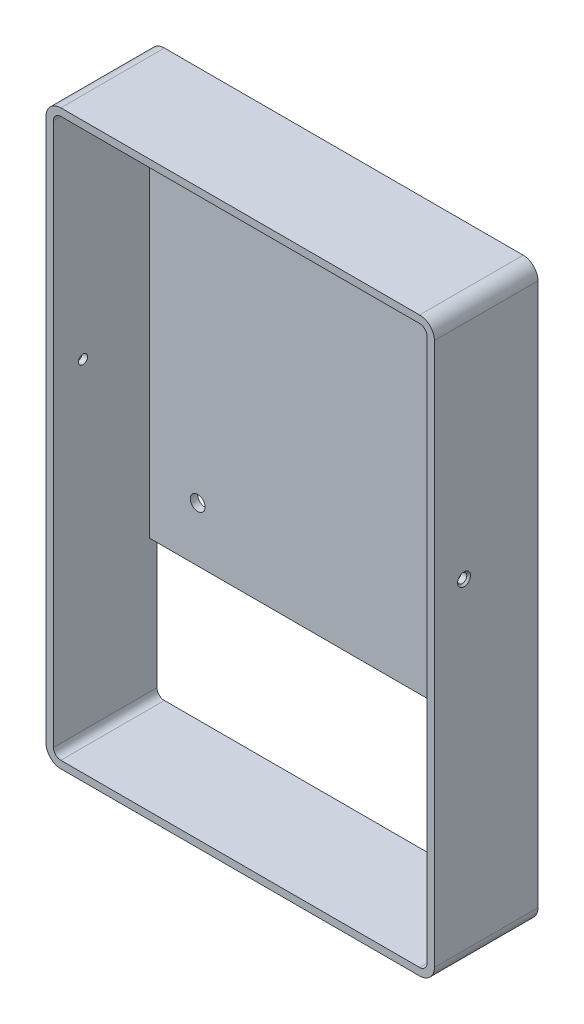
ISO-10303-21;
HEADER;
FILE_DESCRIPTION(('STEP AP214'),'2;1');
FILE_NAME('part.step','',(''),(''),'','','');
FILE_SCHEMA(('AUTOMOTIVE_DESIGN { 1 0 10303 214 1 1 1 1 }'));
ENDSEC;
DATA;
#1=APPLICATION_CONTEXT('core data for automotive mechanical design processes');
#2=APPLICATION_PROTOCOL_DEFINITION('international standard','automotive_design',2000,#1);
#3=PRODUCT_CONTEXT('',#1,'mechanical');
#4=PRODUCT('Part','Part','',(#3));
#5=PRODUCT_RELATED_PRODUCT_CATEGORY('part','',(#4));
#6=PRODUCT_DEFINITION_FORMATION('','',#4);
#7=PRODUCT_DEFINITION_CONTEXT('part definition',#1,'design');
#8=PRODUCT_DEFINITION('design','',#6,#7);
#9=PRODUCT_DEFINITION_SHAPE('','',#8);
#10=(LENGTH_UNIT() NAMED_UNIT(*) SI_UNIT(.MILLI.,.METRE.));
#11=(NAMED_UNIT(*) PLANE_ANGLE_UNIT() SI_UNIT($,.RADIAN.));
#12=(NAMED_UNIT(*) SI_UNIT($,.STERADIAN.) SOLID_ANGLE_UNIT());
#13=UNCERTAINTY_MEASURE_WITH_UNIT(LENGTH_MEASURE(1.E-05),#10,'distance_accuracy_value','');
#14=(GEOMETRIC_REPRESENTATION_CONTEXT(3) GLOBAL_UNCERTAINTY_ASSIGNED_CONTEXT((#13)) GLOBAL_UNIT_ASSIGNED_CONTEXT((#10,
#11,#12)) REPRESENTATION_CONTEXT('',''));
#15=CARTESIAN_POINT('',(0.,0.,0.));
#16=DIRECTION('',(0.,0.,1.));
#17=DIRECTION('',(1.,0.,0.));
#18=AXIS2_PLACEMENT_3D('',#15,#16,#17);
#19=CARTESIAN_POINT('',(48.5,59.875,-28.));
#20=DIRECTION('',(0.,0.,1.));
#21=DIRECTION('',(1.,0.,0.));
#22=AXIS2_PLACEMENT_3D('',#19,#20,#21);
#23=CYLINDRICAL_SURFACE('',#22,4.);
#24=CARTESIAN_POINT('',(48.5,59.875,0.));
#25=DIRECTION('',(0.,0.,1.));
#26=DIRECTION('',(1.,0.,0.));
#27=AXIS2_PLACEMENT_3D('',#24,#25,#26);
#28=CIRCLE('',#27,4.);
#29=CARTESIAN_POINT('',(52.5,59.875,0.));
#30=VERTEX_POINT('',#29);
#31=CARTESIAN_POINT('',(48.5,63.875,0.));
#32=VERTEX_POINT('',#31);
#33=EDGE_CURVE('E211',#30,#32,#28,.T.);
#34=ORIENTED_EDGE('',*,*,#33,.F.);
#35=DIRECTION('',(0.,0.,1.));
#36=VECTOR('',#35,1.);
#37=CARTESIAN_POINT('',(52.5,59.875,-28.));
#38=LINE('',#37,#36);
#39=CARTESIAN_POINT('',(52.5,59.875,-28.));
#40=VERTEX_POINT('',#39);
#41=EDGE_CURVE('E45',#40,#30,#38,.T.);
#42=ORIENTED_EDGE('',*,*,#41,.F.);
#43=CARTESIAN_POINT('',(48.5,59.875,-28.));
#44=DIRECTION('',(0.,0.,1.));
#45=DIRECTION('',(1.,0.,0.));
#46=AXIS2_PLACEMENT_3D('',#43,#44,#45);
#47=CIRCLE('',#46,4.);
#48=CARTESIAN_POINT('',(48.5,63.875,-28.));
#49=VERTEX_POINT('',#48);
#50=EDGE_CURVE('E259',#40,#49,#47,.T.);
#51=ORIENTED_EDGE('',*,*,#50,.T.);
#52=DIRECTION('',(0.,0.,1.));
#53=VECTOR('',#52,1.);
#54=CARTESIAN_POINT('',(48.5,63.875,-28.));
#55=LINE('',#54,#53);
#56=EDGE_CURVE('E285',#49,#32,#55,.T.);
#57=ORIENTED_EDGE('',*,*,#56,.T.);
#58=EDGE_LOOP('',(#34,#42,#51,#57));
#59=FACE_BOUND('',#58,.T.);
#60=ADVANCED_FACE('F38',(#59),#23,.T.);
#61=CARTESIAN_POINT('',(52.5,59.875,-28.));
#62=DIRECTION('',(1.,0.,0.));
#63=DIRECTION('',(0.,1.,0.));
#64=AXIS2_PLACEMENT_3D('',#61,#62,#63);
#65=PLANE('',#64);
#66=CARTESIAN_POINT('',(52.5,0.,-8.));
#67=DIRECTION('',(1.,0.,0.));
#68=DIRECTION('',(0.,0.,-1.));
#69=AXIS2_PLACEMENT_3D('',#66,#67,#68);
#70=CIRCLE('',#69,1.75);
#71=CARTESIAN_POINT('',(52.5,0.,-9.75));
#72=VERTEX_POINT('',#71);
#73=EDGE_CURVE('E648',#72,#72,#70,.T.);
#74=ORIENTED_EDGE('',*,*,#73,.F.);
#75=EDGE_LOOP('',(#74));
#76=FACE_BOUND('',#75,.T.);
#77=DIRECTION('',(0.,1.,0.));
#78=VECTOR('',#77,1.);
#79=CARTESIAN_POINT('',(52.5,59.875,0.));
#80=LINE('',#79,#78);
#81=CARTESIAN_POINT('',(52.5,-86.875,0.));
#82=VERTEX_POINT('',#81);
#83=EDGE_CURVE('E263',#82,#30,#80,.T.);
#84=ORIENTED_EDGE('',*,*,#83,.F.);
#85=DIRECTION('',(0.,0.,1.));
#86=VECTOR('',#85,1.);
#87=CARTESIAN_POINT('',(52.5,-86.875,-28.));
#88=LINE('',#87,#86);
#89=CARTESIAN_POINT('',(52.5,-86.875,-28.));
#90=VERTEX_POINT('',#89);
#91=EDGE_CURVE('E310',#90,#82,#88,.T.);
#92=ORIENTED_EDGE('',*,*,#91,.F.);
#93=DIRECTION('',(0.,1.,0.));
#94=VECTOR('',#93,1.);
#95=CARTESIAN_POINT('',(52.5,59.875,-28.));
#96=LINE('',#95,#94);
#97=EDGE_CURVE('E282',#90,#40,#96,.T.);
#98=ORIENTED_EDGE('',*,*,#97,.T.);
#99=ORIENTED_EDGE('',*,*,#41,.T.);
#100=EDGE_LOOP('',(#84,#92,#98,#99));
#101=FACE_BOUND('',#100,.T.);
#102=ADVANCED_FACE('F367',(#76,#101),#65,.T.);
#103=CARTESIAN_POINT('',(48.5,-86.875,-28.));
#104=DIRECTION('',(0.,0.,1.));
#105=DIRECTION('',(1.,0.,0.));
#106=AXIS2_PLACEMENT_3D('',#103,#104,#105);
#107=CYLINDRICAL_SURFACE('',#106,4.);
#108=CARTESIAN_POINT('',(48.5,-86.875,0.));
#109=DIRECTION('',(0.,0.,1.));
#110=DIRECTION('',(1.,0.,0.));
#111=AXIS2_PLACEMENT_3D('',#108,#109,#110);
#112=CIRCLE('',#111,4.);
#113=CARTESIAN_POINT('',(48.5,-90.875,0.));
#114=VERTEX_POINT('',#113);
#115=EDGE_CURVE('E304',#114,#82,#112,.T.);
#116=ORIENTED_EDGE('',*,*,#115,.F.);
#117=DIRECTION('',(0.,0.,1.));
#118=VECTOR('',#117,1.);
#119=CARTESIAN_POINT('',(48.5,-90.875,-28.));
#120=LINE('',#119,#118);
#121=CARTESIAN_POINT('',(48.5,-90.875,-28.));
#122=VERTEX_POINT('',#121);
#123=EDGE_CURVE('E312',#122,#114,#120,.T.);
#124=ORIENTED_EDGE('',*,*,#123,.F.);
#125=CARTESIAN_POINT('',(48.5,-86.875,-28.));
#126=DIRECTION('',(0.,0.,1.));
#127=DIRECTION('',(1.,0.,0.));
#128=AXIS2_PLACEMENT_3D('',#125,#126,#127);
#129=CIRCLE('',#128,4.);
#130=EDGE_CURVE('E279',#122,#90,#129,.T.);
#131=ORIENTED_EDGE('',*,*,#130,.T.);
#132=ORIENTED_EDGE('',*,*,#91,.T.);
#133=EDGE_LOOP('',(#116,#124,#131,#132));
#134=FACE_BOUND('',#133,.T.);
#135=ADVANCED_FACE('F371',(#134),#107,.T.);
#136=CARTESIAN_POINT('',(-48.5,-90.875,-28.));
#137=DIRECTION('',(0.,-1.,0.));
#138=DIRECTION('',(1.,0.,0.));
#139=AXIS2_PLACEMENT_3D('',#136,#137,#138);
#140=PLANE('',#139);
#141=DIRECTION('',(1.,0.,0.));
#142=VECTOR('',#141,1.);
#143=CARTESIAN_POINT('',(-48.5,-90.875,0.));
#144=LINE('',#143,#142);
#145=CARTESIAN_POINT('',(-48.5,-90.875,0.));
#146=VERTEX_POINT('',#145);
#147=EDGE_CURVE('E301',#146,#114,#144,.T.);
#148=ORIENTED_EDGE('',*,*,#147,.F.);
#149=DIRECTION('',(0.,0.,1.));
#150=VECTOR('',#149,1.);
#151=CARTESIAN_POINT('',(-48.5,-90.875,-28.));
#152=LINE('',#151,#150);
#153=CARTESIAN_POINT('',(-48.5,-90.875,-28.));
#154=VERTEX_POINT('',#153);
#155=EDGE_CURVE('E314',#154,#146,#152,.T.);
#156=ORIENTED_EDGE('',*,*,#155,.F.);
#157=DIRECTION('',(1.,0.,0.));
#158=VECTOR('',#157,1.);
#159=CARTESIAN_POINT('',(-48.5,-90.875,-28.));
#160=LINE('',#159,#158);
#161=EDGE_CURVE('E276',#154,#122,#160,.T.);
#162=ORIENTED_EDGE('',*,*,#161,.T.);
#163=ORIENTED_EDGE('',*,*,#123,.T.);
#164=EDGE_LOOP('',(#148,#156,#162,#163));
#165=FACE_BOUND('',#164,.T.);
#166=ADVANCED_FACE('F376',(#165),#140,.T.);
#167=CARTESIAN_POINT('',(-48.5,-86.875,-28.));
#168=DIRECTION('',(0.,0.,1.));
#169=DIRECTION('',(1.,0.,0.));
#170=AXIS2_PLACEMENT_3D('',#167,#168,#169);
#171=CYLINDRICAL_SURFACE('',#170,4.);
#172=CARTESIAN_POINT('',(-48.5,-86.875,0.));
#173=DIRECTION('',(0.,0.,1.));
#174=DIRECTION('',(-1.,0.,0.));
#175=AXIS2_PLACEMENT_3D('',#172,#173,#174);
#176=CIRCLE('',#175,4.);
#177=CARTESIAN_POINT('',(-52.5,-86.875,0.));
#178=VERTEX_POINT('',#177);
#179=EDGE_CURVE('E298',#178,#146,#176,.T.);
#180=ORIENTED_EDGE('',*,*,#179,.F.);
#181=DIRECTION('',(0.,0.,1.));
#182=VECTOR('',#181,1.);
#183=CARTESIAN_POINT('',(-52.5,-86.875,-28.));
#184=LINE('',#183,#182);
#185=CARTESIAN_POINT('',(-52.5,-86.875,-28.));
#186=VERTEX_POINT('',#185);
#187=EDGE_CURVE('E316',#186,#178,#184,.T.);
#188=ORIENTED_EDGE('',*,*,#187,.F.);
#189=CARTESIAN_POINT('',(-48.5,-86.875,-28.));
#190=DIRECTION('',(0.,0.,1.));
#191=DIRECTION('',(-1.,0.,0.));
#192=AXIS2_PLACEMENT_3D('',#189,#190,#191);
#193=CIRCLE('',#192,4.);
#194=EDGE_CURVE('E273',#186,#154,#193,.T.);
#195=ORIENTED_EDGE('',*,*,#194,.T.);
#196=ORIENTED_EDGE('',*,*,#155,.T.);
#197=EDGE_LOOP('',(#180,#188,#195,#196));
#198=FACE_BOUND('',#197,.T.);
#199=ADVANCED_FACE('F379',(#198),#171,.T.);
#200=CARTESIAN_POINT('',(-52.5,59.875,-28.));
#201=DIRECTION('',(-1.,0.,0.));
#202=DIRECTION('',(0.,-1.,0.));
#203=AXIS2_PLACEMENT_3D('',#200,#201,#202);
#204=PLANE('',#203);
#205=CARTESIAN_POINT('',(-52.5,0.,-8.));
#206=DIRECTION('',(-1.,0.,0.));
#207=DIRECTION('',(0.,0.,1.));
#208=AXIS2_PLACEMENT_3D('',#205,#206,#207);
#209=CIRCLE('',#208,1.75);
#210=CARTESIAN_POINT('',(-52.5,0.,-6.25));
#211=VERTEX_POINT('',#210);
#212=EDGE_CURVE('E641',#211,#211,#209,.T.);
#213=ORIENTED_EDGE('',*,*,#212,.F.);
#214=EDGE_LOOP('',(#213));
#215=FACE_BOUND('',#214,.T.);
#216=DIRECTION('',(0.,-1.,0.));
#217=VECTOR('',#216,1.);
#218=CARTESIAN_POINT('',(-52.5,59.875,0.));
#219=LINE('',#218,#217);
#220=CARTESIAN_POINT('',(-52.5,59.875,0.));
#221=VERTEX_POINT('',#220);
#222=EDGE_CURVE('E294',#221,#178,#219,.T.);
#223=ORIENTED_EDGE('',*,*,#222,.F.);
#224=DIRECTION('',(0.,0.,1.));
#225=VECTOR('',#224,1.);
#226=CARTESIAN_POINT('',(-52.5,59.875,-28.));
#227=LINE('',#226,#225);
#228=CARTESIAN_POINT('',(-52.5,59.875,-28.));
#229=VERTEX_POINT('',#228);
#230=EDGE_CURVE('E318',#229,#221,#227,.T.);
#231=ORIENTED_EDGE('',*,*,#230,.F.);
#232=DIRECTION('',(0.,-1.,0.));
#233=VECTOR('',#232,1.);
#234=CARTESIAN_POINT('',(-52.5,59.875,-28.));
#235=LINE('',#234,#233);
#236=EDGE_CURVE('E269',#229,#186,#235,.T.);
#237=ORIENTED_EDGE('',*,*,#236,.T.);
#238=ORIENTED_EDGE('',*,*,#187,.T.);
#239=EDGE_LOOP('',(#223,#231,#237,#238));
#240=FACE_BOUND('',#239,.T.);
#241=ADVANCED_FACE('F383',(#215,#240),#204,.T.);
#242=CARTESIAN_POINT('',(-48.5,59.875,-28.));
#243=DIRECTION('',(0.,0.,1.));
#244=DIRECTION('',(1.,0.,0.));
#245=AXIS2_PLACEMENT_3D('',#242,#243,#244);
#246=CYLINDRICAL_SURFACE('',#245,4.00000000000001);
#247=CARTESIAN_POINT('',(-48.5,59.875,0.));
#248=DIRECTION('',(0.,0.,1.));
#249=DIRECTION('',(-1.,0.,0.));
#250=AXIS2_PLACEMENT_3D('',#247,#248,#249);
#251=CIRCLE('',#250,4.00000000000001);
#252=CARTESIAN_POINT('',(-48.5,63.875,0.));
#253=VERTEX_POINT('',#252);
#254=EDGE_CURVE('E291',#253,#221,#251,.T.);
#255=ORIENTED_EDGE('',*,*,#254,.F.);
#256=DIRECTION('',(0.,0.,1.));
#257=VECTOR('',#256,1.);
#258=CARTESIAN_POINT('',(-48.5,63.875,-28.));
#259=LINE('',#258,#257);
#260=CARTESIAN_POINT('',(-48.5,63.875,-28.));
#261=VERTEX_POINT('',#260);
#262=EDGE_CURVE('E320',#261,#253,#259,.T.);
#263=ORIENTED_EDGE('',*,*,#262,.F.);
#264=CARTESIAN_POINT('',(-48.5,59.875,-28.));
#265=DIRECTION('',(0.,0.,1.));
#266=DIRECTION('',(-1.,0.,0.));
#267=AXIS2_PLACEMENT_3D('',#264,#265,#266);
#268=CIRCLE('',#267,4.00000000000001);
#269=EDGE_CURVE('E266',#261,#229,#268,.T.);
#270=ORIENTED_EDGE('',*,*,#269,.T.);
#271=ORIENTED_EDGE('',*,*,#230,.T.);
#272=EDGE_LOOP('',(#255,#263,#270,#271));
#273=FACE_BOUND('',#272,.T.);
#274=ADVANCED_FACE('F386',(#273),#246,.T.);
#275=CARTESIAN_POINT('',(-48.5,63.875,-28.));
#276=DIRECTION('',(0.,1.,0.));
#277=DIRECTION('',(-1.,0.,0.));
#278=AXIS2_PLACEMENT_3D('',#275,#276,#277);
#279=PLANE('',#278);
#280=DIRECTION('',(-1.,0.,0.));
#281=VECTOR('',#280,1.);
#282=CARTESIAN_POINT('',(-48.5,63.875,0.));
#283=LINE('',#282,#281);
#284=EDGE_CURVE('E288',#32,#253,#283,.T.);
#285=ORIENTED_EDGE('',*,*,#284,.F.);
#286=ORIENTED_EDGE('',*,*,#56,.F.);
#287=DIRECTION('',(-1.,0.,0.));
#288=VECTOR('',#287,1.);
#289=CARTESIAN_POINT('',(-48.5,63.875,-28.));
#290=LINE('',#289,#288);
#291=EDGE_CURVE('E262',#49,#261,#290,.T.);
#292=ORIENTED_EDGE('',*,*,#291,.T.);
#293=ORIENTED_EDGE('',*,*,#262,.T.);
#294=EDGE_LOOP('',(#285,#286,#292,#293));
#295=FACE_BOUND('',#294,.T.);
#296=ADVANCED_FACE('F357',(#295),#279,.T.);
#297=CARTESIAN_POINT('',(48.5,59.875,-28.));
#298=DIRECTION('',(0.,0.,1.));
#299=DIRECTION('',(1.,0.,0.));
#300=AXIS2_PLACEMENT_3D('',#297,#298,#299);
#301=PLANE('',#300);
#302=CARTESIAN_POINT('',(48.5,-86.875,-28.));
#303=DIRECTION('',(0.,0.,-1.));
#304=DIRECTION('',(-1.,0.,0.));
#305=AXIS2_PLACEMENT_3D('',#302,#303,#304);
#306=CIRCLE('',#305,2.00000000000001);
#307=CARTESIAN_POINT('',(50.5,-86.875,-28.));
#308=VERTEX_POINT('',#307);
#309=CARTESIAN_POINT('',(48.5,-88.875,-28.));
#310=VERTEX_POINT('',#309);
#311=EDGE_CURVE('E171',#308,#310,#306,.T.);
#312=ORIENTED_EDGE('',*,*,#311,.F.);
#313=DIRECTION('',(0.,-1.,0.));
#314=VECTOR('',#313,1.);
#315=CARTESIAN_POINT('',(50.5,-50.875,-28.));
#316=LINE('',#315,#314);
#317=CARTESIAN_POINT('',(50.5,-50.875,-28.));
#318=VERTEX_POINT('',#317);
#319=EDGE_CURVE('E175',#318,#308,#316,.T.);
#320=ORIENTED_EDGE('',*,*,#319,.F.);
#321=DIRECTION('',(1.,0.,0.));
#322=VECTOR('',#321,1.);
#323=CARTESIAN_POINT('',(50.5,-50.875,-28.));
#324=LINE('',#323,#322);
#325=CARTESIAN_POINT('',(-50.5,-50.875,-28.));
#326=VERTEX_POINT('',#325);
#327=EDGE_CURVE('E189',#326,#318,#324,.T.);
#328=ORIENTED_EDGE('',*,*,#327,.F.);
#329=DIRECTION('',(0.,1.,0.));
#330=VECTOR('',#329,1.);
#331=CARTESIAN_POINT('',(-50.5,-50.875,-28.));
#332=LINE('',#331,#330);
#333=CARTESIAN_POINT('',(-50.5,-86.875,-28.));
#334=VERTEX_POINT('',#333);
#335=EDGE_CURVE('E183',#334,#326,#332,.T.);
#336=ORIENTED_EDGE('',*,*,#335,.F.);
#337=CARTESIAN_POINT('',(-48.5,-86.875,-28.));
#338=DIRECTION('',(0.,0.,-1.));
#339=DIRECTION('',(-1.,0.,0.));
#340=AXIS2_PLACEMENT_3D('',#337,#338,#339);
#341=CIRCLE('',#340,2.);
#342=CARTESIAN_POINT('',(-48.5,-88.875,-28.));
#343=VERTEX_POINT('',#342);
#344=EDGE_CURVE('E181',#343,#334,#341,.T.);
#345=ORIENTED_EDGE('',*,*,#344,.F.);
#346=DIRECTION('',(-1.,0.,0.));
#347=VECTOR('',#346,1.);
#348=CARTESIAN_POINT('',(-48.5,-88.875,-28.));
#349=LINE('',#348,#347);
#350=EDGE_CURVE('E163',#310,#343,#349,.T.);
#351=ORIENTED_EDGE('',*,*,#350,.F.);
#352=EDGE_LOOP('',(#312,#320,#328,#336,#345,#351));
#353=FACE_BOUND('',#352,.T.);
#354=CARTESIAN_POINT('',(37.5,-36.125,-28.));
#355=DIRECTION('',(0.,0.,-1.));
#356=DIRECTION('',(-1.,0.,0.));
#357=AXIS2_PLACEMENT_3D('',#354,#355,#356);
#358=CIRCLE('',#357,2.);
#359=CARTESIAN_POINT('',(35.5,-36.125,-28.));
#360=VERTEX_POINT('',#359);
#361=EDGE_CURVE('E195',#360,#360,#358,.T.);
#362=ORIENTED_EDGE('',*,*,#361,.F.);
#363=EDGE_LOOP('',(#362));
#364=FACE_BOUND('',#363,.T.);
#365=CARTESIAN_POINT('',(-37.5,-36.125,-28.));
#366=DIRECTION('',(0.,0.,-1.));
#367=DIRECTION('',(-1.,0.,0.));
#368=AXIS2_PLACEMENT_3D('',#365,#366,#367);
#369=CIRCLE('',#368,2.);
#370=CARTESIAN_POINT('',(-39.5,-36.125,-28.));
#371=VERTEX_POINT('',#370);
#372=EDGE_CURVE('E201',#371,#371,#369,.T.);
#373=ORIENTED_EDGE('',*,*,#372,.F.);
#374=EDGE_LOOP('',(#373));
#375=FACE_BOUND('',#374,.T.);
#376=CARTESIAN_POINT('',(-37.5,48.875,-28.));
#377=DIRECTION('',(0.,0.,-1.));
#378=DIRECTION('',(-1.,0.,0.));
#379=AXIS2_PLACEMENT_3D('',#376,#377,#378);
#380=CIRCLE('',#379,2.);
#381=CARTESIAN_POINT('',(-39.5,48.875,-28.));
#382=VERTEX_POINT('',#381);
#383=EDGE_CURVE('E197',#382,#382,#380,.T.);
#384=ORIENTED_EDGE('',*,*,#383,.F.);
#385=EDGE_LOOP('',(#384));
#386=FACE_BOUND('',#385,.T.);
#387=CARTESIAN_POINT('',(37.5,48.875,-28.));
#388=DIRECTION('',(0.,0.,-1.));
#389=DIRECTION('',(-1.,0.,0.));
#390=AXIS2_PLACEMENT_3D('',#387,#388,#389);
#391=CIRCLE('',#390,2.);
#392=CARTESIAN_POINT('',(35.5,48.875,-28.));
#393=VERTEX_POINT('',#392);
#394=EDGE_CURVE('E204',#393,#393,#391,.T.);
#395=ORIENTED_EDGE('',*,*,#394,.F.);
#396=EDGE_LOOP('',(#395));
#397=FACE_BOUND('',#396,.T.);
#398=ORIENTED_EDGE('',*,*,#50,.F.);
#399=ORIENTED_EDGE('',*,*,#97,.F.);
#400=ORIENTED_EDGE('',*,*,#130,.F.);
#401=ORIENTED_EDGE('',*,*,#161,.F.);
#402=ORIENTED_EDGE('',*,*,#194,.F.);
#403=ORIENTED_EDGE('',*,*,#236,.F.);
#404=ORIENTED_EDGE('',*,*,#269,.F.);
#405=ORIENTED_EDGE('',*,*,#291,.F.);
#406=EDGE_LOOP('',(#398,#399,#400,#401,#402,#403,#404,#405));
#407=FACE_BOUND('',#406,.T.);
#408=ADVANCED_FACE('F177',(#353,#364,#375,#386,#397,#407),#301,.F.);
#409=CARTESIAN_POINT('',(48.5,59.875,0.));
#410=DIRECTION('',(0.,0.,1.));
#411=DIRECTION('',(1.,0.,0.));
#412=AXIS2_PLACEMENT_3D('',#409,#410,#411);
#413=PLANE('',#412);
#414=CARTESIAN_POINT('',(48.5,59.875,0.));
#415=DIRECTION('',(0.,0.,1.));
#416=DIRECTION('',(1.,0.,0.));
#417=AXIS2_PLACEMENT_3D('',#414,#415,#416);
#418=CIRCLE('',#417,2.);
#419=CARTESIAN_POINT('',(50.5,59.875,0.));
#420=VERTEX_POINT('',#419);
#421=CARTESIAN_POINT('',(48.5,61.875,0.));
#422=VERTEX_POINT('',#421);
#423=EDGE_CURVE('E238',#420,#422,#418,.T.);
#424=ORIENTED_EDGE('',*,*,#423,.F.);
#425=DIRECTION('',(0.,1.,0.));
#426=VECTOR('',#425,1.);
#427=CARTESIAN_POINT('',(50.5,59.875,0.));
#428=LINE('',#427,#426);
#429=CARTESIAN_POINT('',(50.5,-86.875,0.));
#430=VERTEX_POINT('',#429);
#431=EDGE_CURVE('E216',#430,#420,#428,.T.);
#432=ORIENTED_EDGE('',*,*,#431,.F.);
#433=CARTESIAN_POINT('',(48.5,-86.875,0.));
#434=DIRECTION('',(0.,0.,1.));
#435=DIRECTION('',(1.,0.,0.));
#436=AXIS2_PLACEMENT_3D('',#433,#434,#435);
#437=CIRCLE('',#436,2.);
#438=CARTESIAN_POINT('',(48.5,-88.875,0.));
#439=VERTEX_POINT('',#438);
#440=EDGE_CURVE('E255',#439,#430,#437,.T.);
#441=ORIENTED_EDGE('',*,*,#440,.F.);
#442=DIRECTION('',(1.,0.,0.));
#443=VECTOR('',#442,1.);
#444=CARTESIAN_POINT('',(48.5,-88.875,0.));
#445=LINE('',#444,#443);
#446=CARTESIAN_POINT('',(-48.5,-88.875,0.));
#447=VERTEX_POINT('',#446);
#448=EDGE_CURVE('E166',#447,#439,#445,.T.);
#449=ORIENTED_EDGE('',*,*,#448,.F.);
#450=CARTESIAN_POINT('',(-48.5,-86.875,0.));
#451=DIRECTION('',(0.,0.,1.));
#452=DIRECTION('',(1.,0.,0.));
#453=AXIS2_PLACEMENT_3D('',#450,#451,#452);
#454=CIRCLE('',#453,2.);
#455=CARTESIAN_POINT('',(-50.5,-86.875,0.));
#456=VERTEX_POINT('',#455);
#457=EDGE_CURVE('E251',#456,#447,#454,.T.);
#458=ORIENTED_EDGE('',*,*,#457,.F.);
#459=DIRECTION('',(0.,-1.,0.));
#460=VECTOR('',#459,1.);
#461=CARTESIAN_POINT('',(-50.5,59.875,0.));
#462=LINE('',#461,#460);
#463=CARTESIAN_POINT('',(-50.5,59.875,0.));
#464=VERTEX_POINT('',#463);
#465=EDGE_CURVE('E247',#464,#456,#462,.T.);
#466=ORIENTED_EDGE('',*,*,#465,.F.);
#467=CARTESIAN_POINT('',(-48.5,59.875,0.));
#468=DIRECTION('',(0.,0.,1.));
#469=DIRECTION('',(1.,0.,0.));
#470=AXIS2_PLACEMENT_3D('',#467,#468,#469);
#471=CIRCLE('',#470,2.00000000000001);
#472=CARTESIAN_POINT('',(-48.5,61.875,0.));
#473=VERTEX_POINT('',#472);
#474=EDGE_CURVE('E244',#473,#464,#471,.T.);
#475=ORIENTED_EDGE('',*,*,#474,.F.);
#476=DIRECTION('',(-1.,0.,0.));
#477=VECTOR('',#476,1.);
#478=CARTESIAN_POINT('',(48.5,61.875,0.));
#479=LINE('',#478,#477);
#480=EDGE_CURVE('E241',#422,#473,#479,.T.);
#481=ORIENTED_EDGE('',*,*,#480,.F.);
#482=EDGE_LOOP('',(#424,#432,#441,#449,#458,#466,#475,#481));
#483=FACE_BOUND('',#482,.T.);
#484=ORIENTED_EDGE('',*,*,#33,.T.);
#485=ORIENTED_EDGE('',*,*,#284,.T.);
#486=ORIENTED_EDGE('',*,*,#254,.T.);
#487=ORIENTED_EDGE('',*,*,#222,.T.);
#488=ORIENTED_EDGE('',*,*,#179,.T.);
#489=ORIENTED_EDGE('',*,*,#147,.T.);
#490=ORIENTED_EDGE('',*,*,#115,.T.);
#491=ORIENTED_EDGE('',*,*,#83,.T.);
#492=EDGE_LOOP('',(#484,#485,#486,#487,#488,#489,#490,#491));
#493=FACE_BOUND('',#492,.T.);
#494=ADVANCED_FACE('F356',(#483,#493),#413,.T.);
#495=CARTESIAN_POINT('',(48.5,59.875,-28.));
#496=DIRECTION('',(0.,0.,1.));
#497=DIRECTION('',(1.,0.,0.));
#498=AXIS2_PLACEMENT_3D('',#495,#496,#497);
#499=CYLINDRICAL_SURFACE('',#498,2.);
#500=ORIENTED_EDGE('',*,*,#423,.T.);
#501=DIRECTION('',(0.,0.,1.));
#502=VECTOR('',#501,1.);
#503=CARTESIAN_POINT('',(48.5,61.875,-28.));
#504=LINE('',#503,#502);
#505=CARTESIAN_POINT('',(48.5,61.875,-26.));
#506=VERTEX_POINT('',#505);
#507=EDGE_CURVE('E217',#506,#422,#504,.T.);
#508=ORIENTED_EDGE('',*,*,#507,.F.);
#509=CARTESIAN_POINT('',(48.5,59.875,-26.));
#510=DIRECTION('',(0.,0.,1.));
#511=DIRECTION('',(1.,0.,0.));
#512=AXIS2_PLACEMENT_3D('',#509,#510,#511);
#513=CIRCLE('',#512,2.);
#514=CARTESIAN_POINT('',(50.5,59.875,-26.));
#515=VERTEX_POINT('',#514);
#516=EDGE_CURVE('E212',#515,#506,#513,.T.);
#517=ORIENTED_EDGE('',*,*,#516,.F.);
#518=DIRECTION('',(0.,0.,1.));
#519=VECTOR('',#518,1.);
#520=CARTESIAN_POINT('',(50.5,59.875,-28.));
#521=LINE('',#520,#519);
#522=EDGE_CURVE('E209',#515,#420,#521,.T.);
#523=ORIENTED_EDGE('',*,*,#522,.T.);
#524=EDGE_LOOP('',(#500,#508,#517,#523));
#525=FACE_BOUND('',#524,.T.);
#526=ADVANCED_FACE('F391',(#525),#499,.F.);
#527=CARTESIAN_POINT('',(50.5,59.875,-28.));
#528=DIRECTION('',(1.,0.,0.));
#529=DIRECTION('',(0.,1.,0.));
#530=AXIS2_PLACEMENT_3D('',#527,#528,#529);
#531=PLANE('',#530);
#532=CARTESIAN_POINT('',(50.5,0.,-8.));
#533=DIRECTION('',(1.,0.,0.));
#534=DIRECTION('',(0.,1.,0.));
#535=AXIS2_PLACEMENT_3D('',#532,#533,#534);
#536=CIRCLE('',#535,1.25);
#537=CARTESIAN_POINT('',(50.5,1.25,-8.));
#538=VERTEX_POINT('',#537);
#539=EDGE_CURVE('E654',#538,#538,#536,.T.);
#540=ORIENTED_EDGE('',*,*,#539,.T.);
#541=EDGE_LOOP('',(#540));
#542=FACE_BOUND('',#541,.T.);
#543=DIRECTION('',(0.,1.,0.));
#544=VECTOR('',#543,1.);
#545=CARTESIAN_POINT('',(50.5,59.875,-26.));
#546=LINE('',#545,#544);
#547=CARTESIAN_POINT('',(50.5,-50.875,-26.));
#548=VERTEX_POINT('',#547);
#549=EDGE_CURVE('E220',#548,#515,#546,.T.);
#550=ORIENTED_EDGE('',*,*,#549,.F.);
#551=DIRECTION('',(0.,0.,-1.));
#552=VECTOR('',#551,1.);
#553=CARTESIAN_POINT('',(50.5,-50.875,-18.));
#554=LINE('',#553,#552);
#555=EDGE_CURVE('E193',#548,#318,#554,.T.);
#556=ORIENTED_EDGE('',*,*,#555,.T.);
#557=ORIENTED_EDGE('',*,*,#319,.T.);
#558=DIRECTION('',(0.,0.,1.));
#559=VECTOR('',#558,1.);
#560=CARTESIAN_POINT('',(50.5,-86.875,-28.));
#561=LINE('',#560,#559);
#562=EDGE_CURVE('E52',#308,#430,#561,.T.);
#563=ORIENTED_EDGE('',*,*,#562,.T.);
#564=ORIENTED_EDGE('',*,*,#431,.T.);
#565=ORIENTED_EDGE('',*,*,#522,.F.);
#566=EDGE_LOOP('',(#550,#556,#557,#563,#564,#565));
#567=FACE_BOUND('',#566,.T.);
#568=ADVANCED_FACE('F397',(#542,#567),#531,.F.);
#569=CARTESIAN_POINT('',(48.5,-86.875,-28.));
#570=DIRECTION('',(0.,0.,1.));
#571=DIRECTION('',(1.,0.,0.));
#572=AXIS2_PLACEMENT_3D('',#569,#570,#571);
#573=CYLINDRICAL_SURFACE('',#572,2.);
#574=DIRECTION('',(0.,0.,1.));
#575=VECTOR('',#574,1.);
#576=CARTESIAN_POINT('',(48.5,-88.875,-28.));
#577=LINE('',#576,#575);
#578=EDGE_CURVE('E160',#310,#439,#577,.T.);
#579=ORIENTED_EDGE('',*,*,#578,.T.);
#580=ORIENTED_EDGE('',*,*,#440,.T.);
#581=ORIENTED_EDGE('',*,*,#562,.F.);
#582=ORIENTED_EDGE('',*,*,#311,.T.);
#583=EDGE_LOOP('',(#579,#580,#581,#582));
#584=FACE_BOUND('',#583,.T.);
#585=ADVANCED_FACE('F172',(#584),#573,.F.);
#586=CARTESIAN_POINT('',(-48.5,-88.875,-28.));
#587=DIRECTION('',(0.,-1.,0.));
#588=DIRECTION('',(1.,0.,0.));
#589=AXIS2_PLACEMENT_3D('',#586,#587,#588);
#590=PLANE('',#589);
#591=DIRECTION('',(0.,0.,1.));
#592=VECTOR('',#591,1.);
#593=CARTESIAN_POINT('',(-48.5,-88.875,-28.));
#594=LINE('',#593,#592);
#595=EDGE_CURVE('E168',#343,#447,#594,.T.);
#596=ORIENTED_EDGE('',*,*,#595,.T.);
#597=ORIENTED_EDGE('',*,*,#448,.T.);
#598=ORIENTED_EDGE('',*,*,#578,.F.);
#599=ORIENTED_EDGE('',*,*,#350,.T.);
#600=EDGE_LOOP('',(#596,#597,#598,#599));
#601=FACE_BOUND('',#600,.T.);
#602=ADVANCED_FACE('F161',(#601),#590,.F.);
#603=CARTESIAN_POINT('',(-48.5,-86.875,-28.));
#604=DIRECTION('',(0.,0.,1.));
#605=DIRECTION('',(1.,0.,0.));
#606=AXIS2_PLACEMENT_3D('',#603,#604,#605);
#607=CYLINDRICAL_SURFACE('',#606,2.);
#608=DIRECTION('',(0.,0.,1.));
#609=VECTOR('',#608,1.);
#610=CARTESIAN_POINT('',(-50.5,-86.875,-28.));
#611=LINE('',#610,#609);
#612=EDGE_CURVE('E225',#334,#456,#611,.T.);
#613=ORIENTED_EDGE('',*,*,#612,.T.);
#614=ORIENTED_EDGE('',*,*,#457,.T.);
#615=ORIENTED_EDGE('',*,*,#595,.F.);
#616=ORIENTED_EDGE('',*,*,#344,.T.);
#617=EDGE_LOOP('',(#613,#614,#615,#616));
#618=FACE_BOUND('',#617,.T.);
#619=ADVANCED_FACE('F455',(#618),#607,.F.);
#620=CARTESIAN_POINT('',(-50.5,59.875,-28.));
#621=DIRECTION('',(-1.,0.,0.));
#622=DIRECTION('',(0.,-1.,0.));
#623=AXIS2_PLACEMENT_3D('',#620,#621,#622);
#624=PLANE('',#623);
#625=CARTESIAN_POINT('',(-50.5,0.,-8.));
#626=DIRECTION('',(-1.,0.,0.));
#627=DIRECTION('',(0.,-1.,0.));
#628=AXIS2_PLACEMENT_3D('',#625,#626,#627);
#629=CIRCLE('',#628,1.25);
#630=CARTESIAN_POINT('',(-50.5,-1.25000000000001,-8.));
#631=VERTEX_POINT('',#630);
#632=EDGE_CURVE('E643',#631,#631,#629,.T.);
#633=ORIENTED_EDGE('',*,*,#632,.T.);
#634=EDGE_LOOP('',(#633));
#635=FACE_BOUND('',#634,.T.);
#636=DIRECTION('',(0.,0.,-1.));
#637=VECTOR('',#636,1.);
#638=CARTESIAN_POINT('',(-50.5,-50.875,-18.));
#639=LINE('',#638,#637);
#640=CARTESIAN_POINT('',(-50.5,-50.875,-26.));
#641=VERTEX_POINT('',#640);
#642=EDGE_CURVE('E192',#641,#326,#639,.T.);
#643=ORIENTED_EDGE('',*,*,#642,.F.);
#644=DIRECTION('',(0.,-1.,0.));
#645=VECTOR('',#644,1.);
#646=CARTESIAN_POINT('',(-50.5,59.875,-26.));
#647=LINE('',#646,#645);
#648=CARTESIAN_POINT('',(-50.5,59.875,-26.));
#649=VERTEX_POINT('',#648);
#650=EDGE_CURVE('E222',#649,#641,#647,.T.);
#651=ORIENTED_EDGE('',*,*,#650,.F.);
#652=DIRECTION('',(0.,0.,1.));
#653=VECTOR('',#652,1.);
#654=CARTESIAN_POINT('',(-50.5,59.875,-28.));
#655=LINE('',#654,#653);
#656=EDGE_CURVE('E227',#649,#464,#655,.T.);
#657=ORIENTED_EDGE('',*,*,#656,.T.);
#658=ORIENTED_EDGE('',*,*,#465,.T.);
#659=ORIENTED_EDGE('',*,*,#612,.F.);
#660=ORIENTED_EDGE('',*,*,#335,.T.);
#661=EDGE_LOOP('',(#643,#651,#657,#658,#659,#660));
#662=FACE_BOUND('',#661,.T.);
#663=ADVANCED_FACE('F451',(#635,#662),#624,.F.);
#664=CARTESIAN_POINT('',(-48.5,59.875,-28.));
#665=DIRECTION('',(0.,0.,1.));
#666=DIRECTION('',(1.,0.,0.));
#667=AXIS2_PLACEMENT_3D('',#664,#665,#666);
#668=CYLINDRICAL_SURFACE('',#667,2.00000000000001);
#669=ORIENTED_EDGE('',*,*,#474,.T.);
#670=ORIENTED_EDGE('',*,*,#656,.F.);
#671=CARTESIAN_POINT('',(-48.5,59.875,-26.));
#672=DIRECTION('',(0.,0.,1.));
#673=DIRECTION('',(1.,0.,0.));
#674=AXIS2_PLACEMENT_3D('',#671,#672,#673);
#675=CIRCLE('',#674,2.00000000000001);
#676=CARTESIAN_POINT('',(-48.5,61.875,-26.));
#677=VERTEX_POINT('',#676);
#678=EDGE_CURVE('E232',#677,#649,#675,.T.);
#679=ORIENTED_EDGE('',*,*,#678,.F.);
#680=DIRECTION('',(0.,0.,1.));
#681=VECTOR('',#680,1.);
#682=CARTESIAN_POINT('',(-48.5,61.875,-28.));
#683=LINE('',#682,#681);
#684=EDGE_CURVE('E219',#677,#473,#683,.T.);
#685=ORIENTED_EDGE('',*,*,#684,.T.);
#686=EDGE_LOOP('',(#669,#670,#679,#685));
#687=FACE_BOUND('',#686,.T.);
#688=ADVANCED_FACE('F454',(#687),#668,.F.);
#689=CARTESIAN_POINT('',(-48.5,61.875,-28.));
#690=DIRECTION('',(0.,1.,0.));
#691=DIRECTION('',(-1.,0.,0.));
#692=AXIS2_PLACEMENT_3D('',#689,#690,#691);
#693=PLANE('',#692);
#694=ORIENTED_EDGE('',*,*,#480,.T.);
#695=ORIENTED_EDGE('',*,*,#684,.F.);
#696=DIRECTION('',(-1.,0.,0.));
#697=VECTOR('',#696,1.);
#698=CARTESIAN_POINT('',(48.5,61.875,-26.));
#699=LINE('',#698,#697);
#700=EDGE_CURVE('E215',#506,#677,#699,.T.);
#701=ORIENTED_EDGE('',*,*,#700,.F.);
#702=ORIENTED_EDGE('',*,*,#507,.T.);
#703=EDGE_LOOP('',(#694,#695,#701,#702));
#704=FACE_BOUND('',#703,.T.);
#705=ADVANCED_FACE('F339',(#704),#693,.F.);
#706=CARTESIAN_POINT('',(48.5,59.875,-26.));
#707=DIRECTION('',(0.,0.,1.));
#708=DIRECTION('',(1.,0.,0.));
#709=AXIS2_PLACEMENT_3D('',#706,#707,#708);
#710=PLANE('',#709);
#711=DIRECTION('',(-1.,0.,0.));
#712=VECTOR('',#711,1.);
#713=CARTESIAN_POINT('',(48.5,-50.875,-26.));
#714=LINE('',#713,#712);
#715=EDGE_CURVE('E11',#548,#641,#714,.T.);
#716=ORIENTED_EDGE('',*,*,#715,.F.);
#717=ORIENTED_EDGE('',*,*,#549,.T.);
#718=ORIENTED_EDGE('',*,*,#516,.T.);
#719=ORIENTED_EDGE('',*,*,#700,.T.);
#720=ORIENTED_EDGE('',*,*,#678,.T.);
#721=ORIENTED_EDGE('',*,*,#650,.T.);
#722=EDGE_LOOP('',(#716,#717,#718,#719,#720,#721));
#723=FACE_BOUND('',#722,.T.);
#724=CARTESIAN_POINT('',(37.5,-36.125,-26.));
#725=DIRECTION('',(0.,0.,1.));
#726=DIRECTION('',(1.,0.,0.));
#727=AXIS2_PLACEMENT_3D('',#724,#725,#726);
#728=CIRCLE('',#727,2.);
#729=CARTESIAN_POINT('',(39.5,-36.125,-26.));
#730=VERTEX_POINT('',#729);
#731=EDGE_CURVE('E208',#730,#730,#728,.T.);
#732=ORIENTED_EDGE('',*,*,#731,.F.);
#733=EDGE_LOOP('',(#732));
#734=FACE_BOUND('',#733,.T.);
#735=CARTESIAN_POINT('',(-37.5,-36.125,-26.));
#736=DIRECTION('',(0.,0.,1.));
#737=DIRECTION('',(1.,0.,0.));
#738=AXIS2_PLACEMENT_3D('',#735,#736,#737);
#739=CIRCLE('',#738,2.);
#740=CARTESIAN_POINT('',(-35.5,-36.125,-26.));
#741=VERTEX_POINT('',#740);
#742=EDGE_CURVE('E327',#741,#741,#739,.T.);
#743=ORIENTED_EDGE('',*,*,#742,.F.);
#744=EDGE_LOOP('',(#743));
#745=FACE_BOUND('',#744,.T.);
#746=CARTESIAN_POINT('',(-37.5,48.875,-26.));
#747=DIRECTION('',(0.,0.,1.));
#748=DIRECTION('',(1.,0.,0.));
#749=AXIS2_PLACEMENT_3D('',#746,#747,#748);
#750=CIRCLE('',#749,2.);
#751=CARTESIAN_POINT('',(-35.5,48.875,-26.));
#752=VERTEX_POINT('',#751);
#753=EDGE_CURVE('E200',#752,#752,#750,.T.);
#754=ORIENTED_EDGE('',*,*,#753,.F.);
#755=EDGE_LOOP('',(#754));
#756=FACE_BOUND('',#755,.T.);
#757=CARTESIAN_POINT('',(37.5,48.875,-26.));
#758=DIRECTION('',(0.,0.,1.));
#759=DIRECTION('',(1.,0.,0.));
#760=AXIS2_PLACEMENT_3D('',#757,#758,#759);
#761=CIRCLE('',#760,2.);
#762=CARTESIAN_POINT('',(39.5,48.875,-26.));
#763=VERTEX_POINT('',#762);
#764=EDGE_CURVE('E207',#763,#763,#761,.T.);
#765=ORIENTED_EDGE('',*,*,#764,.F.);
#766=EDGE_LOOP('',(#765));
#767=FACE_BOUND('',#766,.T.);
#768=ADVANCED_FACE('F335',(#723,#734,#745,#756,#767),#710,.T.);
#769=CARTESIAN_POINT('',(37.5,48.875,-18.));
#770=DIRECTION('',(0.,0.,-1.));
#771=DIRECTION('',(-1.,0.,0.));
#772=AXIS2_PLACEMENT_3D('',#769,#770,#771);
#773=CYLINDRICAL_SURFACE('',#772,2.);
#774=ORIENTED_EDGE('',*,*,#764,.T.);
#775=EDGE_LOOP('',(#774));
#776=FACE_BOUND('',#775,.T.);
#777=ORIENTED_EDGE('',*,*,#394,.T.);
#778=EDGE_LOOP('',(#777));
#779=FACE_BOUND('',#778,.T.);
#780=ADVANCED_FACE('F338',(#776,#779),#773,.F.);
#781=CARTESIAN_POINT('',(-37.5,48.875,-18.));
#782=DIRECTION('',(0.,0.,-1.));
#783=DIRECTION('',(-1.,0.,0.));
#784=AXIS2_PLACEMENT_3D('',#781,#782,#783);
#785=CYLINDRICAL_SURFACE('',#784,2.);
#786=ORIENTED_EDGE('',*,*,#753,.T.);
#787=EDGE_LOOP('',(#786));
#788=FACE_BOUND('',#787,.T.);
#789=ORIENTED_EDGE('',*,*,#383,.T.);
#790=EDGE_LOOP('',(#789));
#791=FACE_BOUND('',#790,.T.);
#792=ADVANCED_FACE('F350',(#788,#791),#785,.F.);
#793=CARTESIAN_POINT('',(-37.5,-36.125,-18.));
#794=DIRECTION('',(0.,0.,-1.));
#795=DIRECTION('',(-1.,0.,0.));
#796=AXIS2_PLACEMENT_3D('',#793,#794,#795);
#797=CYLINDRICAL_SURFACE('',#796,2.);
#798=ORIENTED_EDGE('',*,*,#742,.T.);
#799=EDGE_LOOP('',(#798));
#800=FACE_BOUND('',#799,.T.);
#801=ORIENTED_EDGE('',*,*,#372,.T.);
#802=EDGE_LOOP('',(#801));
#803=FACE_BOUND('',#802,.T.);
#804=ADVANCED_FACE('F498',(#800,#803),#797,.F.);
#805=CARTESIAN_POINT('',(37.5,-36.125,-18.));
#806=DIRECTION('',(0.,0.,-1.));
#807=DIRECTION('',(-1.,0.,0.));
#808=AXIS2_PLACEMENT_3D('',#805,#806,#807);
#809=CYLINDRICAL_SURFACE('',#808,2.);
#810=ORIENTED_EDGE('',*,*,#731,.T.);
#811=EDGE_LOOP('',(#810));
#812=FACE_BOUND('',#811,.T.);
#813=ORIENTED_EDGE('',*,*,#361,.T.);
#814=EDGE_LOOP('',(#813));
#815=FACE_BOUND('',#814,.T.);
#816=ADVANCED_FACE('F332',(#812,#815),#809,.F.);
#817=CARTESIAN_POINT('',(50.5,-50.875,-18.));
#818=DIRECTION('',(0.,1.,0.));
#819=DIRECTION('',(0.,0.,1.));
#820=AXIS2_PLACEMENT_3D('',#817,#818,#819);
#821=PLANE('',#820);
#822=ORIENTED_EDGE('',*,*,#715,.T.);
#823=ORIENTED_EDGE('',*,*,#642,.T.);
#824=ORIENTED_EDGE('',*,*,#327,.T.);
#825=ORIENTED_EDGE('',*,*,#555,.F.);
#826=EDGE_LOOP('',(#822,#823,#824,#825));
#827=FACE_BOUND('',#826,.T.);
#828=ADVANCED_FACE('F481',(#827),#821,.F.);
#829=CARTESIAN_POINT('',(52.5,0.,-8.));
#830=DIRECTION('',(1.,0.,0.));
#831=DIRECTION('',(0.,0.,-1.));
#832=AXIS2_PLACEMENT_3D('',#829,#830,#831);
#833=CYLINDRICAL_SURFACE('',#832,1.25);
#834=ORIENTED_EDGE('',*,*,#539,.F.);
#835=EDGE_LOOP('',(#834));
#836=FACE_BOUND('',#835,.T.);
#837=CARTESIAN_POINT('',(52.,0.,-8.));
#838=DIRECTION('',(1.,0.,0.));
#839=DIRECTION('',(0.,0.,-1.));
#840=AXIS2_PLACEMENT_3D('',#837,#838,#839);
#841=CIRCLE('',#840,1.25);
#842=CARTESIAN_POINT('',(52.,0.,-9.25));
#843=VERTEX_POINT('',#842);
#844=EDGE_CURVE('E651',#843,#843,#841,.T.);
#845=ORIENTED_EDGE('',*,*,#844,.T.);
#846=EDGE_LOOP('',(#845));
#847=FACE_BOUND('',#846,.T.);
#848=ADVANCED_FACE('F486',(#836,#847),#833,.F.);
#849=CARTESIAN_POINT('',(52.5,0.,-8.));
#850=DIRECTION('',(1.,0.,0.));
#851=DIRECTION('',(0.,0.,-1.));
#852=AXIS2_PLACEMENT_3D('',#849,#850,#851);
#853=CONICAL_SURFACE('',#852,1.75,0.785398163397448);
#854=ORIENTED_EDGE('',*,*,#844,.F.);
#855=EDGE_LOOP('',(#854));
#856=FACE_BOUND('',#855,.T.);
#857=ORIENTED_EDGE('',*,*,#73,.T.);
#858=EDGE_LOOP('',(#857));
#859=FACE_BOUND('',#858,.T.);
#860=ADVANCED_FACE('F621',(#856,#859),#853,.F.);
#861=CARTESIAN_POINT('',(-52.5,0.,-8.));
#862=DIRECTION('',(-1.,0.,0.));
#863=DIRECTION('',(0.,0.,1.));
#864=AXIS2_PLACEMENT_3D('',#861,#862,#863);
#865=CYLINDRICAL_SURFACE('',#864,1.25);
#866=ORIENTED_EDGE('',*,*,#632,.F.);
#867=EDGE_LOOP('',(#866));
#868=FACE_BOUND('',#867,.T.);
#869=CARTESIAN_POINT('',(-52.,0.,-8.));
#870=DIRECTION('',(-1.,0.,0.));
#871=DIRECTION('',(0.,0.,1.));
#872=AXIS2_PLACEMENT_3D('',#869,#870,#871);
#873=CIRCLE('',#872,1.25);
#874=CARTESIAN_POINT('',(-52.,0.,-6.75));
#875=VERTEX_POINT('',#874);
#876=EDGE_CURVE('E638',#875,#875,#873,.T.);
#877=ORIENTED_EDGE('',*,*,#876,.T.);
#878=EDGE_LOOP('',(#877));
#879=FACE_BOUND('',#878,.T.);
#880=ADVANCED_FACE('F625',(#868,#879),#865,.F.);
#881=CARTESIAN_POINT('',(-52.5,0.,-8.));
#882=DIRECTION('',(-1.,0.,0.));
#883=DIRECTION('',(0.,0.,1.));
#884=AXIS2_PLACEMENT_3D('',#881,#882,#883);
#885=CONICAL_SURFACE('',#884,1.75,0.785398163397448);
#886=ORIENTED_EDGE('',*,*,#876,.F.);
#887=EDGE_LOOP('',(#886));
#888=FACE_BOUND('',#887,.T.);
#889=ORIENTED_EDGE('',*,*,#212,.T.);
#890=EDGE_LOOP('',(#889));
#891=FACE_BOUND('',#890,.T.);
#892=ADVANCED_FACE('F629',(#888,#891),#885,.F.);
#893=CLOSED_SHELL('',(#60,#102,#135,#166,#199,#241,#274,#296,#408,#494,#526,#568,#585,#602,#619,
#663,#688,#705,#768,#780,#792,#804,#816,#828,#848,#860,#880,#892));
#894=MANIFOLD_SOLID_BREP('B2',#893);
#895=ADVANCED_BREP_SHAPE_REPRESENTATION('',(#18,#894),#14);
#896=SHAPE_DEFINITION_REPRESENTATION(#9,#895);
ENDSEC;
END-ISO-10303-21;
